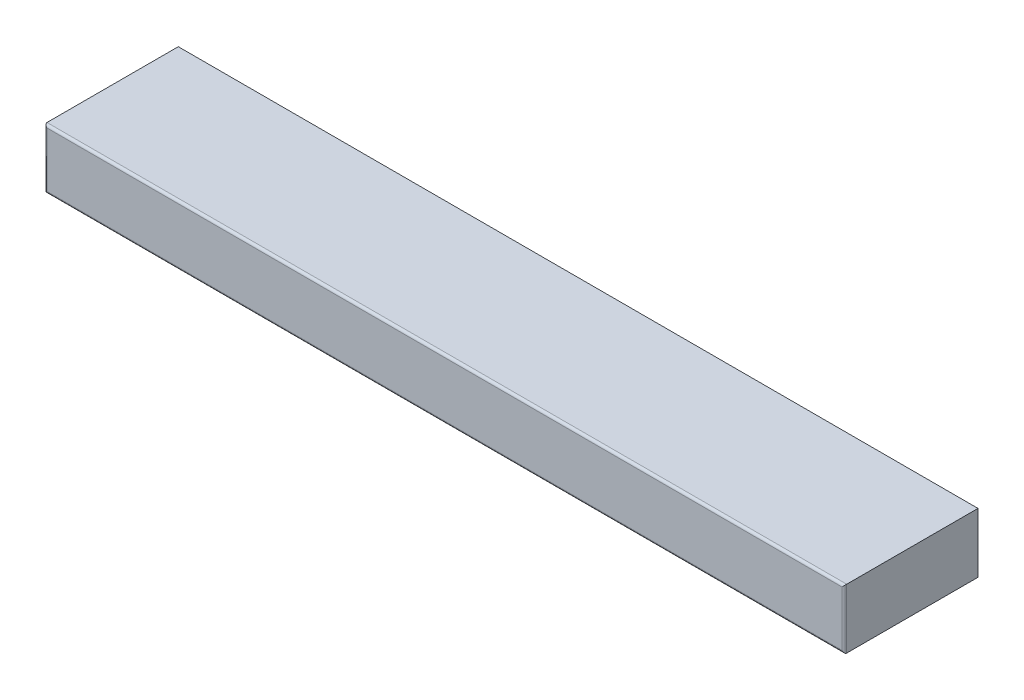
ISO-10303-21;
HEADER;
FILE_DESCRIPTION(('STEP AP214'),'2;1');
FILE_NAME('part.step','',(''),(''),'','','');
FILE_SCHEMA(('AUTOMOTIVE_DESIGN { 1 0 10303 214 1 1 1 1 }'));
ENDSEC;
DATA;
#1=APPLICATION_CONTEXT('core data for automotive mechanical design processes');
#2=APPLICATION_PROTOCOL_DEFINITION('international standard','automotive_design',2000,#1);
#3=PRODUCT_CONTEXT('',#1,'mechanical');
#4=PRODUCT('Part','Part','',(#3));
#5=PRODUCT_RELATED_PRODUCT_CATEGORY('part','',(#4));
#6=PRODUCT_DEFINITION_FORMATION('','',#4);
#7=PRODUCT_DEFINITION_CONTEXT('part definition',#1,'design');
#8=PRODUCT_DEFINITION('design','',#6,#7);
#9=PRODUCT_DEFINITION_SHAPE('','',#8);
#10=(LENGTH_UNIT() NAMED_UNIT(*) SI_UNIT(.MILLI.,.METRE.));
#11=(NAMED_UNIT(*) PLANE_ANGLE_UNIT() SI_UNIT($,.RADIAN.));
#12=(NAMED_UNIT(*) SI_UNIT($,.STERADIAN.) SOLID_ANGLE_UNIT());
#13=UNCERTAINTY_MEASURE_WITH_UNIT(LENGTH_MEASURE(1.E-05),#10,'distance_accuracy_value','');
#14=(GEOMETRIC_REPRESENTATION_CONTEXT(3) GLOBAL_UNCERTAINTY_ASSIGNED_CONTEXT((#13)) GLOBAL_UNIT_ASSIGNED_CONTEXT((#10,
#11,#12)) REPRESENTATION_CONTEXT('',''));
#15=CARTESIAN_POINT('',(0.,0.,0.));
#16=DIRECTION('',(0.,0.,1.));
#17=DIRECTION('',(1.,0.,0.));
#18=AXIS2_PLACEMENT_3D('',#15,#16,#17);
#19=CARTESIAN_POINT('',(33.5,-2.5,11.2));
#20=DIRECTION('',(-1.,0.,0.));
#21=DIRECTION('',(0.,0.,1.));
#22=AXIS2_PLACEMENT_3D('',#19,#20,#21);
#23=PLANE('',#22);
#24=DIRECTION('',(0.,0.,-1.));
#25=VECTOR('',#24,1.);
#26=CARTESIAN_POINT('',(33.5,2.5,11.2));
#27=LINE('',#26,#25);
#28=CARTESIAN_POINT('',(33.5,2.5,11.));
#29=VERTEX_POINT('',#28);
#30=CARTESIAN_POINT('',(33.5,2.5,0.));
#31=VERTEX_POINT('',#30);
#32=EDGE_CURVE('E85',#29,#31,#27,.T.);
#33=ORIENTED_EDGE('',*,*,#32,.F.);
#34=DIRECTION('',(0.,1.,0.));
#35=VECTOR('',#34,1.);
#36=CARTESIAN_POINT('',(33.5,-2.5,11.));
#37=LINE('',#36,#35);
#38=CARTESIAN_POINT('',(33.5,-2.5,11.));
#39=VERTEX_POINT('',#38);
#40=EDGE_CURVE('E11',#29,#39,#37,.F.);
#41=ORIENTED_EDGE('',*,*,#40,.T.);
#42=DIRECTION('',(0.,0.,-1.));
#43=VECTOR('',#42,1.);
#44=CARTESIAN_POINT('',(33.5,-2.5,11.2));
#45=LINE('',#44,#43);
#46=CARTESIAN_POINT('',(33.5,-2.5,0.));
#47=VERTEX_POINT('',#46);
#48=EDGE_CURVE('E105',#39,#47,#45,.T.);
#49=ORIENTED_EDGE('',*,*,#48,.T.);
#50=DIRECTION('',(0.,1.,0.));
#51=VECTOR('',#50,1.);
#52=CARTESIAN_POINT('',(33.5,-2.5,0.));
#53=LINE('',#52,#51);
#54=EDGE_CURVE('E100',#47,#31,#53,.T.);
#55=ORIENTED_EDGE('',*,*,#54,.T.);
#56=EDGE_LOOP('',(#33,#41,#49,#55));
#57=FACE_BOUND('',#56,.T.);
#58=ADVANCED_FACE('F33',(#57),#23,.F.);
#59=CARTESIAN_POINT('',(-33.5,2.5,11.2));
#60=DIRECTION('',(0.,-1.,0.));
#61=DIRECTION('',(0.,0.,-1.));
#62=AXIS2_PLACEMENT_3D('',#59,#60,#61);
#63=PLANE('',#62);
#64=DIRECTION('',(0.,0.,-1.));
#65=VECTOR('',#64,1.);
#66=CARTESIAN_POINT('',(-33.5,2.5,11.2));
#67=LINE('',#66,#65);
#68=CARTESIAN_POINT('',(-33.5,2.5,11.));
#69=VERTEX_POINT('',#68);
#70=CARTESIAN_POINT('',(-33.5,2.5,0.));
#71=VERTEX_POINT('',#70);
#72=EDGE_CURVE('E94',#69,#71,#67,.T.);
#73=ORIENTED_EDGE('',*,*,#72,.F.);
#74=DIRECTION('',(-1.,0.,0.));
#75=VECTOR('',#74,1.);
#76=CARTESIAN_POINT('',(-33.5,2.5,11.));
#77=LINE('',#76,#75);
#78=EDGE_CURVE('E42',#69,#29,#77,.F.);
#79=ORIENTED_EDGE('',*,*,#78,.T.);
#80=ORIENTED_EDGE('',*,*,#32,.T.);
#81=DIRECTION('',(-1.,0.,0.));
#82=VECTOR('',#81,1.);
#83=CARTESIAN_POINT('',(-33.5,2.5,0.));
#84=LINE('',#83,#82);
#85=EDGE_CURVE('E88',#31,#71,#84,.T.);
#86=ORIENTED_EDGE('',*,*,#85,.T.);
#87=EDGE_LOOP('',(#73,#79,#80,#86));
#88=FACE_BOUND('',#87,.T.);
#89=ADVANCED_FACE('F87',(#88),#63,.F.);
#90=CARTESIAN_POINT('',(-33.5,-2.5,11.2));
#91=DIRECTION('',(1.,0.,0.));
#92=DIRECTION('',(0.,0.,-1.));
#93=AXIS2_PLACEMENT_3D('',#90,#91,#92);
#94=PLANE('',#93);
#95=DIRECTION('',(0.,0.,-1.));
#96=VECTOR('',#95,1.);
#97=CARTESIAN_POINT('',(-33.5,-2.5,11.2));
#98=LINE('',#97,#96);
#99=CARTESIAN_POINT('',(-33.5,-2.5,11.));
#100=VERTEX_POINT('',#99);
#101=CARTESIAN_POINT('',(-33.5,-2.5,0.));
#102=VERTEX_POINT('',#101);
#103=EDGE_CURVE('E115',#100,#102,#98,.T.);
#104=ORIENTED_EDGE('',*,*,#103,.F.);
#105=DIRECTION('',(0.,-1.,0.));
#106=VECTOR('',#105,1.);
#107=CARTESIAN_POINT('',(-33.5,-2.5,11.));
#108=LINE('',#107,#106);
#109=EDGE_CURVE('E57',#100,#69,#108,.F.);
#110=ORIENTED_EDGE('',*,*,#109,.T.);
#111=ORIENTED_EDGE('',*,*,#72,.T.);
#112=DIRECTION('',(0.,-1.,0.));
#113=VECTOR('',#112,1.);
#114=CARTESIAN_POINT('',(-33.5,-2.5,0.));
#115=LINE('',#114,#113);
#116=EDGE_CURVE('E102',#71,#102,#115,.T.);
#117=ORIENTED_EDGE('',*,*,#116,.T.);
#118=EDGE_LOOP('',(#104,#110,#111,#117));
#119=FACE_BOUND('',#118,.T.);
#120=ADVANCED_FACE('F153',(#119),#94,.F.);
#121=CARTESIAN_POINT('',(-33.5,-2.5,11.2));
#122=DIRECTION('',(0.,1.,0.));
#123=DIRECTION('',(0.,0.,1.));
#124=AXIS2_PLACEMENT_3D('',#121,#122,#123);
#125=PLANE('',#124);
#126=ORIENTED_EDGE('',*,*,#48,.F.);
#127=DIRECTION('',(1.,0.,0.));
#128=VECTOR('',#127,1.);
#129=CARTESIAN_POINT('',(-33.5,-2.5,11.));
#130=LINE('',#129,#128);
#131=EDGE_CURVE('E126',#39,#100,#130,.F.);
#132=ORIENTED_EDGE('',*,*,#131,.T.);
#133=ORIENTED_EDGE('',*,*,#103,.T.);
#134=DIRECTION('',(1.,0.,0.));
#135=VECTOR('',#134,1.);
#136=CARTESIAN_POINT('',(-33.5,-2.5,0.));
#137=LINE('',#136,#135);
#138=EDGE_CURVE('E112',#102,#47,#137,.T.);
#139=ORIENTED_EDGE('',*,*,#138,.T.);
#140=EDGE_LOOP('',(#126,#132,#133,#139));
#141=FACE_BOUND('',#140,.T.);
#142=ADVANCED_FACE('F152',(#141),#125,.F.);
#143=CARTESIAN_POINT('',(33.5,2.5,11.2));
#144=DIRECTION('',(0.,0.,-1.));
#145=DIRECTION('',(-1.,0.,0.));
#146=AXIS2_PLACEMENT_3D('',#143,#144,#145);
#147=PLANE('',#146);
#148=DIRECTION('',(0.,-1.,0.));
#149=VECTOR('',#148,1.);
#150=CARTESIAN_POINT('',(-33.2999999999999,2.5,11.2));
#151=LINE('',#150,#149);
#152=CARTESIAN_POINT('',(-33.2999999999999,2.3,11.2));
#153=VERTEX_POINT('',#152);
#154=CARTESIAN_POINT('',(-33.2999999999999,-2.3,11.2));
#155=VERTEX_POINT('',#154);
#156=EDGE_CURVE('E121',#153,#155,#151,.T.);
#157=ORIENTED_EDGE('',*,*,#156,.T.);
#158=DIRECTION('',(1.,0.,0.));
#159=VECTOR('',#158,1.);
#160=CARTESIAN_POINT('',(33.5,-2.3,11.2));
#161=LINE('',#160,#159);
#162=CARTESIAN_POINT('',(33.3000000000001,-2.3,11.2));
#163=VERTEX_POINT('',#162);
#164=EDGE_CURVE('E123',#155,#163,#161,.T.);
#165=ORIENTED_EDGE('',*,*,#164,.T.);
#166=DIRECTION('',(0.,1.,0.));
#167=VECTOR('',#166,1.);
#168=CARTESIAN_POINT('',(33.3000000000001,2.5,11.2));
#169=LINE('',#168,#167);
#170=CARTESIAN_POINT('',(33.3000000000001,2.3,11.2));
#171=VERTEX_POINT('',#170);
#172=EDGE_CURVE('E93',#163,#171,#169,.T.);
#173=ORIENTED_EDGE('',*,*,#172,.T.);
#174=DIRECTION('',(-1.,0.,0.));
#175=VECTOR('',#174,1.);
#176=CARTESIAN_POINT('',(33.5,2.3,11.2));
#177=LINE('',#176,#175);
#178=EDGE_CURVE('E119',#171,#153,#177,.T.);
#179=ORIENTED_EDGE('',*,*,#178,.T.);
#180=EDGE_LOOP('',(#157,#165,#173,#179));
#181=FACE_BOUND('',#180,.T.);
#182=ADVANCED_FACE('F145',(#181),#147,.F.);
#183=CARTESIAN_POINT('',(33.5,2.5,0.));
#184=DIRECTION('',(0.,0.,-1.));
#185=DIRECTION('',(-1.,0.,0.));
#186=AXIS2_PLACEMENT_3D('',#183,#184,#185);
#187=PLANE('',#186);
#188=ORIENTED_EDGE('',*,*,#54,.F.);
#189=ORIENTED_EDGE('',*,*,#138,.F.);
#190=ORIENTED_EDGE('',*,*,#116,.F.);
#191=ORIENTED_EDGE('',*,*,#85,.F.);
#192=EDGE_LOOP('',(#188,#189,#190,#191));
#193=FACE_BOUND('',#192,.T.);
#194=ADVANCED_FACE('F98',(#193),#187,.T.);
#195=CARTESIAN_POINT('',(33.5,2.3,11.));
#196=DIRECTION('',(-1.,0.,0.));
#197=DIRECTION('',(0.,0.,1.));
#198=AXIS2_PLACEMENT_3D('',#195,#196,#197);
#199=CYLINDRICAL_SURFACE('',#198,0.2);
#200=CARTESIAN_POINT('',(33.3000000000001,2.3,11.));
#201=DIRECTION('',(-0.707106781186547,0.707106781186547,0.));
#202=DIRECTION('',(0.707106781186547,0.707106781186547,0.));
#203=AXIS2_PLACEMENT_3D('',#200,#201,#202);
#204=ELLIPSE('',#203,0.282842712474619,0.2);
#205=EDGE_CURVE('E109',#29,#171,#204,.F.);
#206=ORIENTED_EDGE('',*,*,#205,.F.);
#207=ORIENTED_EDGE('',*,*,#78,.F.);
#208=CARTESIAN_POINT('',(-33.2999999999999,2.3,11.));
#209=DIRECTION('',(-0.707106781186547,-0.707106781186547,0.));
#210=DIRECTION('',(-0.707106781186547,0.707106781186547,0.));
#211=AXIS2_PLACEMENT_3D('',#208,#209,#210);
#212=ELLIPSE('',#211,0.282842712474619,0.2);
#213=EDGE_CURVE('E37',#153,#69,#212,.T.);
#214=ORIENTED_EDGE('',*,*,#213,.F.);
#215=ORIENTED_EDGE('',*,*,#178,.F.);
#216=EDGE_LOOP('',(#206,#207,#214,#215));
#217=FACE_BOUND('',#216,.T.);
#218=ADVANCED_FACE('F35',(#217),#199,.T.);
#219=CARTESIAN_POINT('',(-33.2999999999999,2.5,11.));
#220=DIRECTION('',(0.,-1.,0.));
#221=DIRECTION('',(0.,0.,-1.));
#222=AXIS2_PLACEMENT_3D('',#219,#220,#221);
#223=CYLINDRICAL_SURFACE('',#222,0.2);
#224=ORIENTED_EDGE('',*,*,#213,.T.);
#225=ORIENTED_EDGE('',*,*,#109,.F.);
#226=CARTESIAN_POINT('',(-33.2999999999999,-2.3,11.));
#227=DIRECTION('',(0.707106781186547,-0.707106781186547,0.));
#228=DIRECTION('',(-0.707106781186547,-0.707106781186547,0.));
#229=AXIS2_PLACEMENT_3D('',#226,#227,#228);
#230=ELLIPSE('',#229,0.282842712474619,0.2);
#231=EDGE_CURVE('E133',#155,#100,#230,.T.);
#232=ORIENTED_EDGE('',*,*,#231,.F.);
#233=ORIENTED_EDGE('',*,*,#156,.F.);
#234=EDGE_LOOP('',(#224,#225,#232,#233));
#235=FACE_BOUND('',#234,.T.);
#236=ADVANCED_FACE('F170',(#235),#223,.T.);
#237=CARTESIAN_POINT('',(33.3000000000001,2.5,11.));
#238=DIRECTION('',(0.,1.,0.));
#239=DIRECTION('',(0.,0.,1.));
#240=AXIS2_PLACEMENT_3D('',#237,#238,#239);
#241=CYLINDRICAL_SURFACE('',#240,0.2);
#242=ORIENTED_EDGE('',*,*,#205,.T.);
#243=ORIENTED_EDGE('',*,*,#172,.F.);
#244=CARTESIAN_POINT('',(33.3000000000001,-2.3,11.));
#245=DIRECTION('',(0.707106781186547,0.707106781186547,0.));
#246=DIRECTION('',(-0.707106781186547,0.707106781186547,0.));
#247=AXIS2_PLACEMENT_3D('',#244,#245,#246);
#248=ELLIPSE('',#247,0.282842712474619,0.2);
#249=EDGE_CURVE('E131',#39,#163,#248,.F.);
#250=ORIENTED_EDGE('',*,*,#249,.F.);
#251=ORIENTED_EDGE('',*,*,#40,.F.);
#252=EDGE_LOOP('',(#242,#243,#250,#251));
#253=FACE_BOUND('',#252,.T.);
#254=ADVANCED_FACE('F138',(#253),#241,.T.);
#255=CARTESIAN_POINT('',(33.5,-2.3,11.));
#256=DIRECTION('',(1.,0.,0.));
#257=DIRECTION('',(0.,0.,-1.));
#258=AXIS2_PLACEMENT_3D('',#255,#256,#257);
#259=CYLINDRICAL_SURFACE('',#258,0.2);
#260=ORIENTED_EDGE('',*,*,#231,.T.);
#261=ORIENTED_EDGE('',*,*,#131,.F.);
#262=ORIENTED_EDGE('',*,*,#249,.T.);
#263=ORIENTED_EDGE('',*,*,#164,.F.);
#264=EDGE_LOOP('',(#260,#261,#262,#263));
#265=FACE_BOUND('',#264,.T.);
#266=ADVANCED_FACE('F149',(#265),#259,.T.);
#267=CLOSED_SHELL('',(#58,#89,#120,#142,#182,#194,#218,#236,#254,#266));
#268=MANIFOLD_SOLID_BREP('B2',#267);
#269=ADVANCED_BREP_SHAPE_REPRESENTATION('',(#18,#268),#14);
#270=SHAPE_DEFINITION_REPRESENTATION(#9,#269);
ENDSEC;
END-ISO-10303-21;
